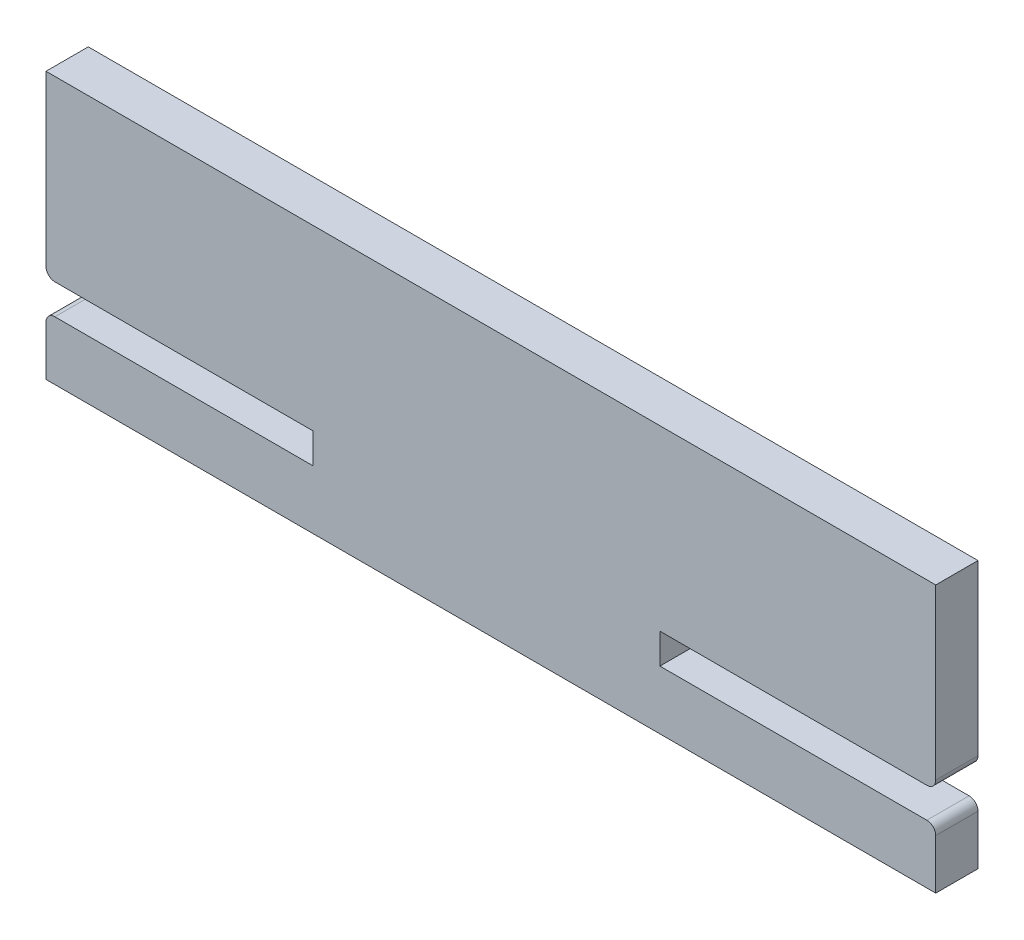
ISO-10303-21;
HEADER;
FILE_DESCRIPTION(('STEP AP214'),'2;1');
FILE_NAME('part.step','',(''),(''),'','','');
FILE_SCHEMA(('AUTOMOTIVE_DESIGN { 1 0 10303 214 1 1 1 1 }'));
ENDSEC;
DATA;
#1=APPLICATION_CONTEXT('core data for automotive mechanical design processes');
#2=APPLICATION_PROTOCOL_DEFINITION('international standard','automotive_design',2000,#1);
#3=PRODUCT_CONTEXT('',#1,'mechanical');
#4=PRODUCT('Part','Part','',(#3));
#5=PRODUCT_RELATED_PRODUCT_CATEGORY('part','',(#4));
#6=PRODUCT_DEFINITION_FORMATION('','',#4);
#7=PRODUCT_DEFINITION_CONTEXT('part definition',#1,'design');
#8=PRODUCT_DEFINITION('design','',#6,#7);
#9=PRODUCT_DEFINITION_SHAPE('','',#8);
#10=(LENGTH_UNIT() NAMED_UNIT(*) SI_UNIT(.MILLI.,.METRE.));
#11=(NAMED_UNIT(*) PLANE_ANGLE_UNIT() SI_UNIT($,.RADIAN.));
#12=(NAMED_UNIT(*) SI_UNIT($,.STERADIAN.) SOLID_ANGLE_UNIT());
#13=UNCERTAINTY_MEASURE_WITH_UNIT(LENGTH_MEASURE(1.E-05),#10,'distance_accuracy_value','');
#14=(GEOMETRIC_REPRESENTATION_CONTEXT(3) GLOBAL_UNCERTAINTY_ASSIGNED_CONTEXT((#13)) GLOBAL_UNIT_ASSIGNED_CONTEXT((#10,
#11,#12)) REPRESENTATION_CONTEXT('',''));
#15=CARTESIAN_POINT('',(0.,0.,0.));
#16=DIRECTION('',(0.,0.,1.));
#17=DIRECTION('',(1.,0.,0.));
#18=AXIS2_PLACEMENT_3D('',#15,#16,#17);
#19=CARTESIAN_POINT('',(61.2953367875648,-9.4,4.75));
#20=DIRECTION('',(-1.,0.,0.));
#21=DIRECTION('',(0.,-1.,0.));
#22=AXIS2_PLACEMENT_3D('',#19,#20,#21);
#23=PLANE('',#22);
#24=DIRECTION('',(0.,1.,0.));
#25=VECTOR('',#24,1.);
#26=CARTESIAN_POINT('',(61.2953367875648,-9.4,0.));
#27=LINE('',#26,#25);
#28=CARTESIAN_POINT('',(61.2953367875648,-15.,0.));
#29=VERTEX_POINT('',#28);
#30=CARTESIAN_POINT('',(61.2953367875648,-9.4,0.));
#31=VERTEX_POINT('',#30);
#32=EDGE_CURVE('E177',#29,#31,#27,.T.);
#33=ORIENTED_EDGE('',*,*,#32,.T.);
#34=DIRECTION('',(0.,0.,-1.));
#35=VECTOR('',#34,1.);
#36=CARTESIAN_POINT('',(61.2953367875648,-9.4,4.75));
#37=LINE('',#36,#35);
#38=CARTESIAN_POINT('',(61.2953367875648,-9.4,4.75));
#39=VERTEX_POINT('',#38);
#40=EDGE_CURVE('E11',#39,#31,#37,.T.);
#41=ORIENTED_EDGE('',*,*,#40,.F.);
#42=DIRECTION('',(0.,1.,0.));
#43=VECTOR('',#42,1.);
#44=CARTESIAN_POINT('',(61.2953367875648,-9.4,4.75));
#45=LINE('',#44,#43);
#46=CARTESIAN_POINT('',(61.2953367875648,-15.,4.75));
#47=VERTEX_POINT('',#46);
#48=EDGE_CURVE('E207',#47,#39,#45,.T.);
#49=ORIENTED_EDGE('',*,*,#48,.F.);
#50=DIRECTION('',(0.,0.,-1.));
#51=VECTOR('',#50,1.);
#52=CARTESIAN_POINT('',(61.2953367875648,-15.,4.75));
#53=LINE('',#52,#51);
#54=EDGE_CURVE('E173',#47,#29,#53,.T.);
#55=ORIENTED_EDGE('',*,*,#54,.T.);
#56=EDGE_LOOP('',(#33,#41,#49,#55));
#57=FACE_BOUND('',#56,.T.);
#58=ADVANCED_FACE('F33',(#57),#23,.F.);
#59=CARTESIAN_POINT('',(60.2953367875648,-9.4,4.75));
#60=DIRECTION('',(0.,0.,-1.));
#61=DIRECTION('',(-1.,0.,0.));
#62=AXIS2_PLACEMENT_3D('',#59,#60,#61);
#63=CYLINDRICAL_SURFACE('',#62,1.);
#64=CARTESIAN_POINT('',(60.2953367875648,-9.4,0.));
#65=DIRECTION('',(0.,0.,1.));
#66=DIRECTION('',(-1.,0.,0.));
#67=AXIS2_PLACEMENT_3D('',#64,#65,#66);
#68=CIRCLE('',#67,1.);
#69=CARTESIAN_POINT('',(60.2953367875648,-8.4,0.));
#70=VERTEX_POINT('',#69);
#71=EDGE_CURVE('E180',#31,#70,#68,.T.);
#72=ORIENTED_EDGE('',*,*,#71,.T.);
#73=DIRECTION('',(0.,0.,-1.));
#74=VECTOR('',#73,1.);
#75=CARTESIAN_POINT('',(60.2953367875648,-8.4,4.75));
#76=LINE('',#75,#74);
#77=CARTESIAN_POINT('',(60.2953367875648,-8.4,4.75));
#78=VERTEX_POINT('',#77);
#79=EDGE_CURVE('E41',#78,#70,#76,.T.);
#80=ORIENTED_EDGE('',*,*,#79,.F.);
#81=CARTESIAN_POINT('',(60.2953367875648,-9.4,4.75));
#82=DIRECTION('',(0.,0.,1.));
#83=DIRECTION('',(-1.,0.,0.));
#84=AXIS2_PLACEMENT_3D('',#81,#82,#83);
#85=CIRCLE('',#84,1.);
#86=EDGE_CURVE('E116',#39,#78,#85,.T.);
#87=ORIENTED_EDGE('',*,*,#86,.F.);
#88=ORIENTED_EDGE('',*,*,#40,.T.);
#89=EDGE_LOOP('',(#72,#80,#87,#88));
#90=FACE_BOUND('',#89,.T.);
#91=ADVANCED_FACE('F305',(#90),#63,.T.);
#92=CARTESIAN_POINT('',(30.2953367875648,-8.4,4.75));
#93=DIRECTION('',(0.,-1.,0.));
#94=DIRECTION('',(0.,0.,-1.));
#95=AXIS2_PLACEMENT_3D('',#92,#93,#94);
#96=PLANE('',#95);
#97=DIRECTION('',(-1.,0.,0.));
#98=VECTOR('',#97,1.);
#99=CARTESIAN_POINT('',(30.2953367875648,-8.4,0.));
#100=LINE('',#99,#98);
#101=CARTESIAN_POINT('',(30.2953367875648,-8.4,0.));
#102=VERTEX_POINT('',#101);
#103=EDGE_CURVE('E182',#70,#102,#100,.T.);
#104=ORIENTED_EDGE('',*,*,#103,.T.);
#105=DIRECTION('',(0.,0.,-1.));
#106=VECTOR('',#105,1.);
#107=CARTESIAN_POINT('',(30.2953367875648,-8.4,4.75));
#108=LINE('',#107,#106);
#109=CARTESIAN_POINT('',(30.2953367875648,-8.4,4.75));
#110=VERTEX_POINT('',#109);
#111=EDGE_CURVE('E238',#110,#102,#108,.T.);
#112=ORIENTED_EDGE('',*,*,#111,.F.);
#113=DIRECTION('',(-1.,0.,0.));
#114=VECTOR('',#113,1.);
#115=CARTESIAN_POINT('',(30.2953367875648,-8.4,4.75));
#116=LINE('',#115,#114);
#117=EDGE_CURVE('E246',#78,#110,#116,.T.);
#118=ORIENTED_EDGE('',*,*,#117,.F.);
#119=ORIENTED_EDGE('',*,*,#79,.T.);
#120=EDGE_LOOP('',(#104,#112,#118,#119));
#121=FACE_BOUND('',#120,.T.);
#122=ADVANCED_FACE('F244',(#121),#96,.F.);
#123=CARTESIAN_POINT('',(30.2953367875648,-5.,4.75));
#124=DIRECTION('',(-1.,0.,0.));
#125=DIRECTION('',(0.,0.,1.));
#126=AXIS2_PLACEMENT_3D('',#123,#124,#125);
#127=PLANE('',#126);
#128=DIRECTION('',(0.,1.,0.));
#129=VECTOR('',#128,1.);
#130=CARTESIAN_POINT('',(30.2953367875648,-5.,0.));
#131=LINE('',#130,#129);
#132=CARTESIAN_POINT('',(30.2953367875648,-5.,0.));
#133=VERTEX_POINT('',#132);
#134=EDGE_CURVE('E184',#102,#133,#131,.T.);
#135=ORIENTED_EDGE('',*,*,#134,.T.);
#136=DIRECTION('',(0.,0.,-1.));
#137=VECTOR('',#136,1.);
#138=CARTESIAN_POINT('',(30.2953367875648,-5.,4.75));
#139=LINE('',#138,#137);
#140=CARTESIAN_POINT('',(30.2953367875648,-5.,4.75));
#141=VERTEX_POINT('',#140);
#142=EDGE_CURVE('E235',#141,#133,#139,.T.);
#143=ORIENTED_EDGE('',*,*,#142,.F.);
#144=DIRECTION('',(0.,1.,0.));
#145=VECTOR('',#144,1.);
#146=CARTESIAN_POINT('',(30.2953367875648,-5.,4.75));
#147=LINE('',#146,#145);
#148=EDGE_CURVE('E264',#110,#141,#147,.T.);
#149=ORIENTED_EDGE('',*,*,#148,.F.);
#150=ORIENTED_EDGE('',*,*,#111,.T.);
#151=EDGE_LOOP('',(#135,#143,#149,#150));
#152=FACE_BOUND('',#151,.T.);
#153=ADVANCED_FACE('F255',(#152),#127,.F.);
#154=CARTESIAN_POINT('',(60.2953367875648,-5.,4.75));
#155=DIRECTION('',(0.,1.,0.));
#156=DIRECTION('',(0.,0.,1.));
#157=AXIS2_PLACEMENT_3D('',#154,#155,#156);
#158=PLANE('',#157);
#159=DIRECTION('',(1.,0.,0.));
#160=VECTOR('',#159,1.);
#161=CARTESIAN_POINT('',(60.2953367875648,-5.,0.));
#162=LINE('',#161,#160);
#163=CARTESIAN_POINT('',(60.2953367875648,-5.,0.));
#164=VERTEX_POINT('',#163);
#165=EDGE_CURVE('E186',#133,#164,#162,.T.);
#166=ORIENTED_EDGE('',*,*,#165,.T.);
#167=DIRECTION('',(0.,0.,-1.));
#168=VECTOR('',#167,1.);
#169=CARTESIAN_POINT('',(60.2953367875648,-5.,4.75));
#170=LINE('',#169,#168);
#171=CARTESIAN_POINT('',(60.2953367875648,-5.,4.75));
#172=VERTEX_POINT('',#171);
#173=EDGE_CURVE('E232',#172,#164,#170,.T.);
#174=ORIENTED_EDGE('',*,*,#173,.F.);
#175=DIRECTION('',(1.,0.,0.));
#176=VECTOR('',#175,1.);
#177=CARTESIAN_POINT('',(60.2953367875648,-5.,4.75));
#178=LINE('',#177,#176);
#179=EDGE_CURVE('E261',#141,#172,#178,.T.);
#180=ORIENTED_EDGE('',*,*,#179,.F.);
#181=ORIENTED_EDGE('',*,*,#142,.T.);
#182=EDGE_LOOP('',(#166,#174,#180,#181));
#183=FACE_BOUND('',#182,.T.);
#184=ADVANCED_FACE('F259',(#183),#158,.F.);
#185=CARTESIAN_POINT('',(60.2953367875648,-4.,4.75));
#186=DIRECTION('',(0.,0.,-1.));
#187=DIRECTION('',(-1.,0.,0.));
#188=AXIS2_PLACEMENT_3D('',#185,#186,#187);
#189=CYLINDRICAL_SURFACE('',#188,1.);
#190=CARTESIAN_POINT('',(60.2953367875648,-4.,0.));
#191=DIRECTION('',(0.,0.,1.));
#192=DIRECTION('',(1.,0.,0.));
#193=AXIS2_PLACEMENT_3D('',#190,#191,#192);
#194=CIRCLE('',#193,1.);
#195=CARTESIAN_POINT('',(61.2953367875648,-4.,0.));
#196=VERTEX_POINT('',#195);
#197=EDGE_CURVE('E188',#164,#196,#194,.T.);
#198=ORIENTED_EDGE('',*,*,#197,.T.);
#199=DIRECTION('',(0.,0.,-1.));
#200=VECTOR('',#199,1.);
#201=CARTESIAN_POINT('',(61.2953367875648,-4.,4.75));
#202=LINE('',#201,#200);
#203=CARTESIAN_POINT('',(61.2953367875648,-4.,4.75));
#204=VERTEX_POINT('',#203);
#205=EDGE_CURVE('E229',#204,#196,#202,.T.);
#206=ORIENTED_EDGE('',*,*,#205,.F.);
#207=CARTESIAN_POINT('',(60.2953367875648,-4.,4.75));
#208=DIRECTION('',(0.,0.,1.));
#209=DIRECTION('',(1.,0.,0.));
#210=AXIS2_PLACEMENT_3D('',#207,#208,#209);
#211=CIRCLE('',#210,1.);
#212=EDGE_CURVE('E263',#172,#204,#211,.T.);
#213=ORIENTED_EDGE('',*,*,#212,.F.);
#214=ORIENTED_EDGE('',*,*,#173,.T.);
#215=EDGE_LOOP('',(#198,#206,#213,#214));
#216=FACE_BOUND('',#215,.T.);
#217=ADVANCED_FACE('F318',(#216),#189,.T.);
#218=CARTESIAN_POINT('',(61.2953367875648,15.,4.75));
#219=DIRECTION('',(-1.,0.,0.));
#220=DIRECTION('',(0.,0.,1.));
#221=AXIS2_PLACEMENT_3D('',#218,#219,#220);
#222=PLANE('',#221);
#223=DIRECTION('',(0.,1.,0.));
#224=VECTOR('',#223,1.);
#225=CARTESIAN_POINT('',(61.2953367875648,15.,0.));
#226=LINE('',#225,#224);
#227=CARTESIAN_POINT('',(61.2953367875648,15.,0.));
#228=VERTEX_POINT('',#227);
#229=EDGE_CURVE('E190',#196,#228,#226,.T.);
#230=ORIENTED_EDGE('',*,*,#229,.T.);
#231=DIRECTION('',(0.,0.,-1.));
#232=VECTOR('',#231,1.);
#233=CARTESIAN_POINT('',(61.2953367875648,15.,4.75));
#234=LINE('',#233,#232);
#235=CARTESIAN_POINT('',(61.2953367875648,15.,4.75));
#236=VERTEX_POINT('',#235);
#237=EDGE_CURVE('E226',#236,#228,#234,.T.);
#238=ORIENTED_EDGE('',*,*,#237,.F.);
#239=DIRECTION('',(0.,1.,0.));
#240=VECTOR('',#239,1.);
#241=CARTESIAN_POINT('',(61.2953367875648,15.,4.75));
#242=LINE('',#241,#240);
#243=EDGE_CURVE('E266',#204,#236,#242,.T.);
#244=ORIENTED_EDGE('',*,*,#243,.F.);
#245=ORIENTED_EDGE('',*,*,#205,.T.);
#246=EDGE_LOOP('',(#230,#238,#244,#245));
#247=FACE_BOUND('',#246,.T.);
#248=ADVANCED_FACE('F321',(#247),#222,.F.);
#249=CARTESIAN_POINT('',(-38.7046632124352,15.,4.75));
#250=DIRECTION('',(0.,-1.,0.));
#251=DIRECTION('',(0.,0.,-1.));
#252=AXIS2_PLACEMENT_3D('',#249,#250,#251);
#253=PLANE('',#252);
#254=DIRECTION('',(-1.,0.,0.));
#255=VECTOR('',#254,1.);
#256=CARTESIAN_POINT('',(-38.7046632124352,15.,0.));
#257=LINE('',#256,#255);
#258=CARTESIAN_POINT('',(-38.7046632124352,15.,0.));
#259=VERTEX_POINT('',#258);
#260=EDGE_CURVE('E192',#228,#259,#257,.T.);
#261=ORIENTED_EDGE('',*,*,#260,.T.);
#262=DIRECTION('',(0.,0.,-1.));
#263=VECTOR('',#262,1.);
#264=CARTESIAN_POINT('',(-38.7046632124352,15.,4.75));
#265=LINE('',#264,#263);
#266=CARTESIAN_POINT('',(-38.7046632124352,15.,4.75));
#267=VERTEX_POINT('',#266);
#268=EDGE_CURVE('E223',#267,#259,#265,.T.);
#269=ORIENTED_EDGE('',*,*,#268,.F.);
#270=DIRECTION('',(-1.,0.,0.));
#271=VECTOR('',#270,1.);
#272=CARTESIAN_POINT('',(-38.7046632124352,15.,4.75));
#273=LINE('',#272,#271);
#274=EDGE_CURVE('E272',#236,#267,#273,.T.);
#275=ORIENTED_EDGE('',*,*,#274,.F.);
#276=ORIENTED_EDGE('',*,*,#237,.T.);
#277=EDGE_LOOP('',(#261,#269,#275,#276));
#278=FACE_BOUND('',#277,.T.);
#279=ADVANCED_FACE('F325',(#278),#253,.F.);
#280=CARTESIAN_POINT('',(-38.7046632124352,15.,4.75));
#281=DIRECTION('',(1.,0.,0.));
#282=DIRECTION('',(0.,0.,-1.));
#283=AXIS2_PLACEMENT_3D('',#280,#281,#282);
#284=PLANE('',#283);
#285=DIRECTION('',(0.,-1.,0.));
#286=VECTOR('',#285,1.);
#287=CARTESIAN_POINT('',(-38.7046632124352,15.,0.));
#288=LINE('',#287,#286);
#289=CARTESIAN_POINT('',(-38.7046632124352,-4.,0.));
#290=VERTEX_POINT('',#289);
#291=EDGE_CURVE('E194',#259,#290,#288,.T.);
#292=ORIENTED_EDGE('',*,*,#291,.T.);
#293=DIRECTION('',(0.,0.,-1.));
#294=VECTOR('',#293,1.);
#295=CARTESIAN_POINT('',(-38.7046632124352,-4.,4.75));
#296=LINE('',#295,#294);
#297=CARTESIAN_POINT('',(-38.7046632124352,-4.,4.75));
#298=VERTEX_POINT('',#297);
#299=EDGE_CURVE('E220',#298,#290,#296,.T.);
#300=ORIENTED_EDGE('',*,*,#299,.F.);
#301=DIRECTION('',(0.,-1.,0.));
#302=VECTOR('',#301,1.);
#303=CARTESIAN_POINT('',(-38.7046632124352,15.,4.75));
#304=LINE('',#303,#302);
#305=EDGE_CURVE('E274',#267,#298,#304,.T.);
#306=ORIENTED_EDGE('',*,*,#305,.F.);
#307=ORIENTED_EDGE('',*,*,#268,.T.);
#308=EDGE_LOOP('',(#292,#300,#306,#307));
#309=FACE_BOUND('',#308,.T.);
#310=ADVANCED_FACE('F329',(#309),#284,.F.);
#311=CARTESIAN_POINT('',(-37.7046632124352,-4.,4.75));
#312=DIRECTION('',(0.,0.,-1.));
#313=DIRECTION('',(-1.,0.,0.));
#314=AXIS2_PLACEMENT_3D('',#311,#312,#313);
#315=CYLINDRICAL_SURFACE('',#314,1.);
#316=CARTESIAN_POINT('',(-37.7046632124352,-4.,0.));
#317=DIRECTION('',(0.,0.,1.));
#318=DIRECTION('',(-1.,0.,0.));
#319=AXIS2_PLACEMENT_3D('',#316,#317,#318);
#320=CIRCLE('',#319,1.);
#321=CARTESIAN_POINT('',(-37.7046632124352,-5.,0.));
#322=VERTEX_POINT('',#321);
#323=EDGE_CURVE('E196',#290,#322,#320,.T.);
#324=ORIENTED_EDGE('',*,*,#323,.T.);
#325=DIRECTION('',(0.,0.,-1.));
#326=VECTOR('',#325,1.);
#327=CARTESIAN_POINT('',(-37.7046632124352,-5.,4.75));
#328=LINE('',#327,#326);
#329=CARTESIAN_POINT('',(-37.7046632124352,-5.,4.75));
#330=VERTEX_POINT('',#329);
#331=EDGE_CURVE('E217',#330,#322,#328,.T.);
#332=ORIENTED_EDGE('',*,*,#331,.F.);
#333=CARTESIAN_POINT('',(-37.7046632124352,-4.,4.75));
#334=DIRECTION('',(0.,0.,1.));
#335=DIRECTION('',(-1.,0.,0.));
#336=AXIS2_PLACEMENT_3D('',#333,#334,#335);
#337=CIRCLE('',#336,1.);
#338=EDGE_CURVE('E276',#298,#330,#337,.T.);
#339=ORIENTED_EDGE('',*,*,#338,.F.);
#340=ORIENTED_EDGE('',*,*,#299,.T.);
#341=EDGE_LOOP('',(#324,#332,#339,#340));
#342=FACE_BOUND('',#341,.T.);
#343=ADVANCED_FACE('F333',(#342),#315,.T.);
#344=CARTESIAN_POINT('',(-37.7046632124352,-5.,4.75));
#345=DIRECTION('',(0.,1.,0.));
#346=DIRECTION('',(0.,0.,1.));
#347=AXIS2_PLACEMENT_3D('',#344,#345,#346);
#348=PLANE('',#347);
#349=DIRECTION('',(1.,0.,0.));
#350=VECTOR('',#349,1.);
#351=CARTESIAN_POINT('',(-37.7046632124352,-5.,0.));
#352=LINE('',#351,#350);
#353=CARTESIAN_POINT('',(-8.70466321243524,-5.,0.));
#354=VERTEX_POINT('',#353);
#355=EDGE_CURVE('E198',#322,#354,#352,.T.);
#356=ORIENTED_EDGE('',*,*,#355,.T.);
#357=DIRECTION('',(0.,0.,-1.));
#358=VECTOR('',#357,1.);
#359=CARTESIAN_POINT('',(-8.70466321243524,-5.,4.75));
#360=LINE('',#359,#358);
#361=CARTESIAN_POINT('',(-8.70466321243524,-5.,4.75));
#362=VERTEX_POINT('',#361);
#363=EDGE_CURVE('E214',#362,#354,#360,.T.);
#364=ORIENTED_EDGE('',*,*,#363,.F.);
#365=DIRECTION('',(1.,0.,0.));
#366=VECTOR('',#365,1.);
#367=CARTESIAN_POINT('',(-37.7046632124352,-5.,4.75));
#368=LINE('',#367,#366);
#369=EDGE_CURVE('E278',#330,#362,#368,.T.);
#370=ORIENTED_EDGE('',*,*,#369,.F.);
#371=ORIENTED_EDGE('',*,*,#331,.T.);
#372=EDGE_LOOP('',(#356,#364,#370,#371));
#373=FACE_BOUND('',#372,.T.);
#374=ADVANCED_FACE('F337',(#373),#348,.F.);
#375=CARTESIAN_POINT('',(-8.70466321243524,-5.,4.75));
#376=DIRECTION('',(1.,0.,0.));
#377=DIRECTION('',(0.,0.,-1.));
#378=AXIS2_PLACEMENT_3D('',#375,#376,#377);
#379=PLANE('',#378);
#380=DIRECTION('',(0.,-1.,0.));
#381=VECTOR('',#380,1.);
#382=CARTESIAN_POINT('',(-8.70466321243524,-5.,0.));
#383=LINE('',#382,#381);
#384=CARTESIAN_POINT('',(-8.70466321243524,-8.4,0.));
#385=VERTEX_POINT('',#384);
#386=EDGE_CURVE('E200',#354,#385,#383,.T.);
#387=ORIENTED_EDGE('',*,*,#386,.T.);
#388=DIRECTION('',(0.,0.,-1.));
#389=VECTOR('',#388,1.);
#390=CARTESIAN_POINT('',(-8.70466321243524,-8.4,4.75));
#391=LINE('',#390,#389);
#392=CARTESIAN_POINT('',(-8.70466321243524,-8.4,4.75));
#393=VERTEX_POINT('',#392);
#394=EDGE_CURVE('E211',#393,#385,#391,.T.);
#395=ORIENTED_EDGE('',*,*,#394,.F.);
#396=DIRECTION('',(0.,-1.,0.));
#397=VECTOR('',#396,1.);
#398=CARTESIAN_POINT('',(-8.70466321243524,-5.,4.75));
#399=LINE('',#398,#397);
#400=EDGE_CURVE('E280',#362,#393,#399,.T.);
#401=ORIENTED_EDGE('',*,*,#400,.F.);
#402=ORIENTED_EDGE('',*,*,#363,.T.);
#403=EDGE_LOOP('',(#387,#395,#401,#402));
#404=FACE_BOUND('',#403,.T.);
#405=ADVANCED_FACE('F286',(#404),#379,.F.);
#406=CARTESIAN_POINT('',(-8.70466321243524,-8.4,4.75));
#407=DIRECTION('',(0.,-1.,0.));
#408=DIRECTION('',(1.,0.,0.));
#409=AXIS2_PLACEMENT_3D('',#406,#407,#408);
#410=PLANE('',#409);
#411=DIRECTION('',(-1.,0.,0.));
#412=VECTOR('',#411,1.);
#413=CARTESIAN_POINT('',(-8.70466321243524,-8.4,0.));
#414=LINE('',#413,#412);
#415=CARTESIAN_POINT('',(-37.7046632124352,-8.4,0.));
#416=VERTEX_POINT('',#415);
#417=EDGE_CURVE('E202',#385,#416,#414,.T.);
#418=ORIENTED_EDGE('',*,*,#417,.T.);
#419=DIRECTION('',(0.,0.,-1.));
#420=VECTOR('',#419,1.);
#421=CARTESIAN_POINT('',(-37.7046632124352,-8.4,4.75));
#422=LINE('',#421,#420);
#423=CARTESIAN_POINT('',(-37.7046632124352,-8.4,4.75));
#424=VERTEX_POINT('',#423);
#425=EDGE_CURVE('E168',#424,#416,#422,.T.);
#426=ORIENTED_EDGE('',*,*,#425,.F.);
#427=DIRECTION('',(-1.,0.,0.));
#428=VECTOR('',#427,1.);
#429=CARTESIAN_POINT('',(-8.70466321243524,-8.4,4.75));
#430=LINE('',#429,#428);
#431=EDGE_CURVE('E159',#393,#424,#430,.T.);
#432=ORIENTED_EDGE('',*,*,#431,.F.);
#433=ORIENTED_EDGE('',*,*,#394,.T.);
#434=EDGE_LOOP('',(#418,#426,#432,#433));
#435=FACE_BOUND('',#434,.T.);
#436=ADVANCED_FACE('F290',(#435),#410,.F.);
#437=CARTESIAN_POINT('',(-37.7046632124352,-9.40000000000001,4.75));
#438=DIRECTION('',(0.,0.,-1.));
#439=DIRECTION('',(-1.,0.,0.));
#440=AXIS2_PLACEMENT_3D('',#437,#438,#439);
#441=CYLINDRICAL_SURFACE('',#440,1.);
#442=CARTESIAN_POINT('',(-37.7046632124352,-9.40000000000001,0.));
#443=DIRECTION('',(0.,0.,1.));
#444=DIRECTION('',(1.,0.,0.));
#445=AXIS2_PLACEMENT_3D('',#442,#443,#444);
#446=CIRCLE('',#445,1.);
#447=CARTESIAN_POINT('',(-38.7046632124352,-9.40000000000001,0.));
#448=VERTEX_POINT('',#447);
#449=EDGE_CURVE('E167',#416,#448,#446,.T.);
#450=ORIENTED_EDGE('',*,*,#449,.T.);
#451=DIRECTION('',(0.,0.,-1.));
#452=VECTOR('',#451,1.);
#453=CARTESIAN_POINT('',(-38.7046632124352,-9.40000000000001,4.75));
#454=LINE('',#453,#452);
#455=CARTESIAN_POINT('',(-38.7046632124352,-9.40000000000001,4.75));
#456=VERTEX_POINT('',#455);
#457=EDGE_CURVE('E164',#456,#448,#454,.T.);
#458=ORIENTED_EDGE('',*,*,#457,.F.);
#459=CARTESIAN_POINT('',(-37.7046632124352,-9.40000000000001,4.75));
#460=DIRECTION('',(0.,0.,1.));
#461=DIRECTION('',(1.,0.,0.));
#462=AXIS2_PLACEMENT_3D('',#459,#460,#461);
#463=CIRCLE('',#462,1.);
#464=EDGE_CURVE('E153',#424,#456,#463,.T.);
#465=ORIENTED_EDGE('',*,*,#464,.F.);
#466=ORIENTED_EDGE('',*,*,#425,.T.);
#467=EDGE_LOOP('',(#450,#458,#465,#466));
#468=FACE_BOUND('',#467,.T.);
#469=ADVANCED_FACE('F165',(#468),#441,.T.);
#470=CARTESIAN_POINT('',(-38.7046632124352,-9.40000000000001,4.75));
#471=DIRECTION('',(1.,0.,0.));
#472=DIRECTION('',(0.,0.,-1.));
#473=AXIS2_PLACEMENT_3D('',#470,#471,#472);
#474=PLANE('',#473);
#475=DIRECTION('',(0.,-1.,0.));
#476=VECTOR('',#475,1.);
#477=CARTESIAN_POINT('',(-38.7046632124352,-9.40000000000001,0.));
#478=LINE('',#477,#476);
#479=CARTESIAN_POINT('',(-38.7046632124352,-15.,0.));
#480=VERTEX_POINT('',#479);
#481=EDGE_CURVE('E102',#448,#480,#478,.T.);
#482=ORIENTED_EDGE('',*,*,#481,.T.);
#483=DIRECTION('',(0.,0.,-1.));
#484=VECTOR('',#483,1.);
#485=CARTESIAN_POINT('',(-38.7046632124352,-15.,4.75));
#486=LINE('',#485,#484);
#487=CARTESIAN_POINT('',(-38.7046632124352,-15.,4.75));
#488=VERTEX_POINT('',#487);
#489=EDGE_CURVE('E169',#488,#480,#486,.T.);
#490=ORIENTED_EDGE('',*,*,#489,.F.);
#491=DIRECTION('',(0.,-1.,0.));
#492=VECTOR('',#491,1.);
#493=CARTESIAN_POINT('',(-38.7046632124352,-9.40000000000001,4.75));
#494=LINE('',#493,#492);
#495=EDGE_CURVE('E157',#456,#488,#494,.T.);
#496=ORIENTED_EDGE('',*,*,#495,.F.);
#497=ORIENTED_EDGE('',*,*,#457,.T.);
#498=EDGE_LOOP('',(#482,#490,#496,#497));
#499=FACE_BOUND('',#498,.T.);
#500=ADVANCED_FACE('F171',(#499),#474,.F.);
#501=CARTESIAN_POINT('',(-38.7046632124352,-15.,4.75));
#502=DIRECTION('',(0.,1.,0.));
#503=DIRECTION('',(0.,0.,1.));
#504=AXIS2_PLACEMENT_3D('',#501,#502,#503);
#505=PLANE('',#504);
#506=DIRECTION('',(1.,0.,0.));
#507=VECTOR('',#506,1.);
#508=CARTESIAN_POINT('',(-38.7046632124352,-15.,0.));
#509=LINE('',#508,#507);
#510=EDGE_CURVE('E108',#480,#29,#509,.T.);
#511=ORIENTED_EDGE('',*,*,#510,.T.);
#512=ORIENTED_EDGE('',*,*,#54,.F.);
#513=DIRECTION('',(1.,0.,0.));
#514=VECTOR('',#513,1.);
#515=CARTESIAN_POINT('',(-38.7046632124352,-15.,4.75));
#516=LINE('',#515,#514);
#517=EDGE_CURVE('E49',#488,#47,#516,.T.);
#518=ORIENTED_EDGE('',*,*,#517,.F.);
#519=ORIENTED_EDGE('',*,*,#489,.T.);
#520=EDGE_LOOP('',(#511,#512,#518,#519));
#521=FACE_BOUND('',#520,.T.);
#522=ADVANCED_FACE('F294',(#521),#505,.F.);
#523=CARTESIAN_POINT('',(-37.7046632124352,-9.40000000000001,4.75));
#524=DIRECTION('',(0.,0.,1.));
#525=DIRECTION('',(1.,0.,0.));
#526=AXIS2_PLACEMENT_3D('',#523,#524,#525);
#527=PLANE('',#526);
#528=ORIENTED_EDGE('',*,*,#48,.T.);
#529=ORIENTED_EDGE('',*,*,#86,.T.);
#530=ORIENTED_EDGE('',*,*,#117,.T.);
#531=ORIENTED_EDGE('',*,*,#148,.T.);
#532=ORIENTED_EDGE('',*,*,#179,.T.);
#533=ORIENTED_EDGE('',*,*,#212,.T.);
#534=ORIENTED_EDGE('',*,*,#243,.T.);
#535=ORIENTED_EDGE('',*,*,#274,.T.);
#536=ORIENTED_EDGE('',*,*,#305,.T.);
#537=ORIENTED_EDGE('',*,*,#338,.T.);
#538=ORIENTED_EDGE('',*,*,#369,.T.);
#539=ORIENTED_EDGE('',*,*,#400,.T.);
#540=ORIENTED_EDGE('',*,*,#431,.T.);
#541=ORIENTED_EDGE('',*,*,#464,.T.);
#542=ORIENTED_EDGE('',*,*,#495,.T.);
#543=ORIENTED_EDGE('',*,*,#517,.T.);
#544=EDGE_LOOP('',(#528,#529,#530,#531,#532,#533,#534,#535,#536,#537,#538,#539,#540,#541,#542,#543));
#545=FACE_BOUND('',#544,.T.);
#546=ADVANCED_FACE('F155',(#545),#527,.T.);
#547=CARTESIAN_POINT('',(-37.7046632124352,-9.40000000000001,0.));
#548=DIRECTION('',(0.,0.,1.));
#549=DIRECTION('',(1.,0.,0.));
#550=AXIS2_PLACEMENT_3D('',#547,#548,#549);
#551=PLANE('',#550);
#552=ORIENTED_EDGE('',*,*,#32,.F.);
#553=ORIENTED_EDGE('',*,*,#510,.F.);
#554=ORIENTED_EDGE('',*,*,#481,.F.);
#555=ORIENTED_EDGE('',*,*,#449,.F.);
#556=ORIENTED_EDGE('',*,*,#417,.F.);
#557=ORIENTED_EDGE('',*,*,#386,.F.);
#558=ORIENTED_EDGE('',*,*,#355,.F.);
#559=ORIENTED_EDGE('',*,*,#323,.F.);
#560=ORIENTED_EDGE('',*,*,#291,.F.);
#561=ORIENTED_EDGE('',*,*,#260,.F.);
#562=ORIENTED_EDGE('',*,*,#229,.F.);
#563=ORIENTED_EDGE('',*,*,#197,.F.);
#564=ORIENTED_EDGE('',*,*,#165,.F.);
#565=ORIENTED_EDGE('',*,*,#134,.F.);
#566=ORIENTED_EDGE('',*,*,#103,.F.);
#567=ORIENTED_EDGE('',*,*,#71,.F.);
#568=EDGE_LOOP('',(#552,#553,#554,#555,#556,#557,#558,#559,#560,#561,#562,#563,#564,#565,#566,#567));
#569=FACE_BOUND('',#568,.T.);
#570=ADVANCED_FACE('F250',(#569),#551,.F.);
#571=CLOSED_SHELL('',(#58,#91,#122,#153,#184,#217,#248,#279,#310,#343,#374,#405,#436,#469,#500,
#522,#546,#570));
#572=MANIFOLD_SOLID_BREP('B2',#571);
#573=ADVANCED_BREP_SHAPE_REPRESENTATION('',(#18,#572),#14);
#574=SHAPE_DEFINITION_REPRESENTATION(#9,#573);
ENDSEC;
END-ISO-10303-21;
